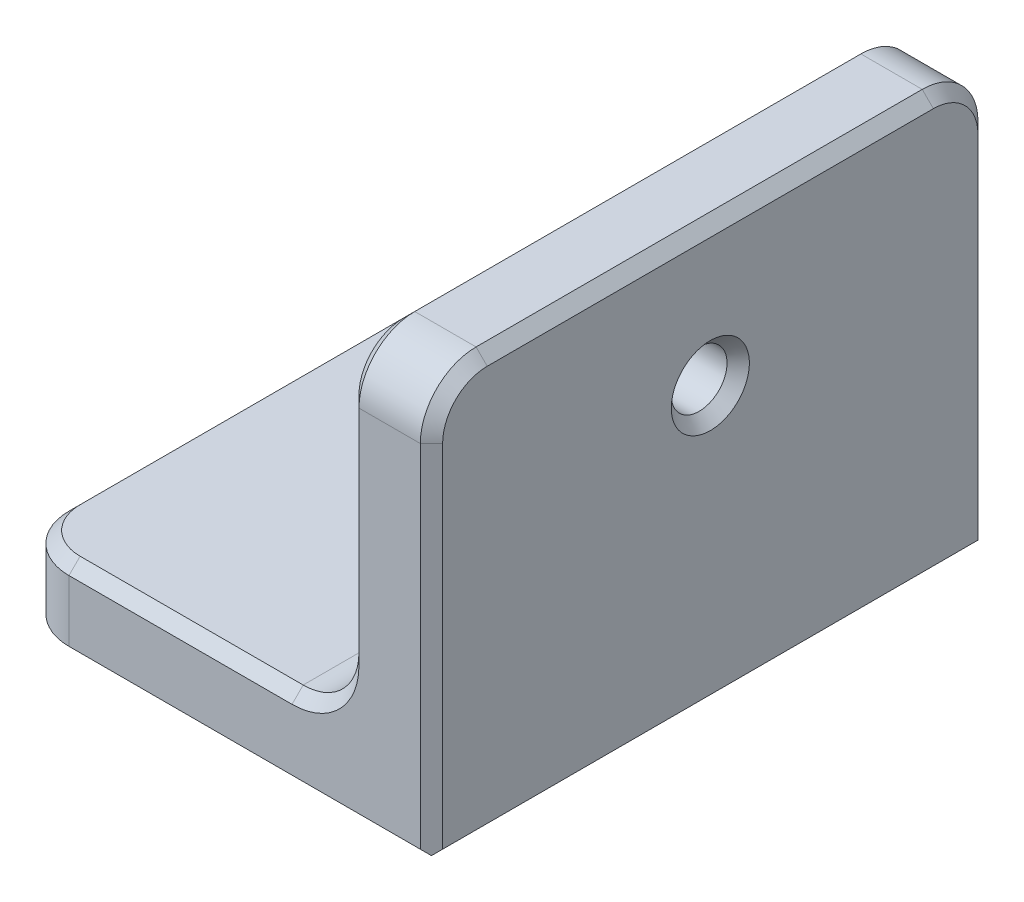
ISO-10303-21;
HEADER;
FILE_DESCRIPTION(('STEP AP214'),'2;1');
FILE_NAME('part.step','',(''),(''),'','','');
FILE_SCHEMA(('AUTOMOTIVE_DESIGN { 1 0 10303 214 1 1 1 1 }'));
ENDSEC;
DATA;
#1=APPLICATION_CONTEXT('core data for automotive mechanical design processes');
#2=APPLICATION_PROTOCOL_DEFINITION('international standard','automotive_design',2000,#1);
#3=PRODUCT_CONTEXT('',#1,'mechanical');
#4=PRODUCT('Part','Part','',(#3));
#5=PRODUCT_RELATED_PRODUCT_CATEGORY('part','',(#4));
#6=PRODUCT_DEFINITION_FORMATION('','',#4);
#7=PRODUCT_DEFINITION_CONTEXT('part definition',#1,'design');
#8=PRODUCT_DEFINITION('design','',#6,#7);
#9=PRODUCT_DEFINITION_SHAPE('','',#8);
#10=(LENGTH_UNIT() NAMED_UNIT(*) SI_UNIT(.MILLI.,.METRE.));
#11=(NAMED_UNIT(*) PLANE_ANGLE_UNIT() SI_UNIT($,.RADIAN.));
#12=(NAMED_UNIT(*) SI_UNIT($,.STERADIAN.) SOLID_ANGLE_UNIT());
#13=UNCERTAINTY_MEASURE_WITH_UNIT(LENGTH_MEASURE(1.E-05),#10,'distance_accuracy_value','');
#14=(GEOMETRIC_REPRESENTATION_CONTEXT(3) GLOBAL_UNCERTAINTY_ASSIGNED_CONTEXT((#13)) GLOBAL_UNIT_ASSIGNED_CONTEXT((#10,
#11,#12)) REPRESENTATION_CONTEXT('',''));
#15=CARTESIAN_POINT('',(0.,0.,0.));
#16=DIRECTION('',(0.,0.,1.));
#17=DIRECTION('',(1.,0.,0.));
#18=AXIS2_PLACEMENT_3D('',#15,#16,#17);
#19=CARTESIAN_POINT('',(0.,3.,0.));
#20=DIRECTION('',(0.,-1.,0.));
#21=DIRECTION('',(0.,0.,-1.));
#22=AXIS2_PLACEMENT_3D('',#19,#20,#21);
#23=PLANE('',#22);
#24=CARTESIAN_POINT('',(5.5,3.,-10.));
#25=DIRECTION('',(0.,1.,0.));
#26=DIRECTION('',(0.,0.,1.));
#27=AXIS2_PLACEMENT_3D('',#24,#25,#26);
#28=CIRCLE('',#27,1.6);
#29=CARTESIAN_POINT('',(5.5,3.,-8.4));
#30=VERTEX_POINT('',#29);
#31=EDGE_CURVE('E261',#30,#30,#28,.T.);
#32=ORIENTED_EDGE('',*,*,#31,.F.);
#33=EDGE_LOOP('',(#32));
#34=FACE_BOUND('',#33,.T.);
#35=CARTESIAN_POINT('',(2.,3.,-2.));
#36=DIRECTION('',(0.,-1.,0.));
#37=DIRECTION('',(0.,0.,-1.));
#38=AXIS2_PLACEMENT_3D('',#35,#36,#37);
#39=CIRCLE('',#38,1.6);
#40=CARTESIAN_POINT('',(0.400000000000001,3.,-2.));
#41=VERTEX_POINT('',#40);
#42=CARTESIAN_POINT('',(2.,3.,-0.400000000000001));
#43=VERTEX_POINT('',#42);
#44=EDGE_CURVE('E330',#41,#43,#39,.F.);
#45=ORIENTED_EDGE('',*,*,#44,.T.);
#46=DIRECTION('',(1.,0.,0.));
#47=VECTOR('',#46,1.);
#48=CARTESIAN_POINT('',(0.,3.,-0.400000000000001));
#49=LINE('',#48,#47);
#50=CARTESIAN_POINT('',(10.,3.,-0.400000000000001));
#51=VERTEX_POINT('',#50);
#52=EDGE_CURVE('E332',#43,#51,#49,.T.);
#53=ORIENTED_EDGE('',*,*,#52,.T.);
#54=DIRECTION('',(0.,0.,1.));
#55=VECTOR('',#54,1.);
#56=CARTESIAN_POINT('',(10.,3.,-20.));
#57=LINE('',#56,#55);
#58=CARTESIAN_POINT('',(10.,3.,-19.6));
#59=VERTEX_POINT('',#58);
#60=EDGE_CURVE('E504',#51,#59,#57,.F.);
#61=ORIENTED_EDGE('',*,*,#60,.T.);
#62=DIRECTION('',(-1.,0.,0.));
#63=VECTOR('',#62,1.);
#64=CARTESIAN_POINT('',(0.,3.,-19.6));
#65=LINE('',#64,#63);
#66=CARTESIAN_POINT('',(2.,3.,-19.6));
#67=VERTEX_POINT('',#66);
#68=EDGE_CURVE('E324',#59,#67,#65,.T.);
#69=ORIENTED_EDGE('',*,*,#68,.T.);
#70=CARTESIAN_POINT('',(2.,3.,-18.));
#71=DIRECTION('',(0.,-1.,0.));
#72=DIRECTION('',(0.,0.,-1.));
#73=AXIS2_PLACEMENT_3D('',#70,#71,#72);
#74=CIRCLE('',#73,1.6);
#75=CARTESIAN_POINT('',(0.400000000000001,3.,-18.));
#76=VERTEX_POINT('',#75);
#77=EDGE_CURVE('E326',#67,#76,#74,.F.);
#78=ORIENTED_EDGE('',*,*,#77,.T.);
#79=DIRECTION('',(0.,0.,1.));
#80=VECTOR('',#79,1.);
#81=CARTESIAN_POINT('',(0.400000000000001,3.,0.));
#82=LINE('',#81,#80);
#83=EDGE_CURVE('E328',#76,#41,#82,.T.);
#84=ORIENTED_EDGE('',*,*,#83,.T.);
#85=EDGE_LOOP('',(#45,#53,#61,#69,#78,#84));
#86=FACE_BOUND('',#85,.T.);
#87=ADVANCED_FACE('F37',(#34,#86),#23,.F.);
#88=CARTESIAN_POINT('',(0.,3.,0.));
#89=DIRECTION('',(1.,0.,0.));
#90=DIRECTION('',(0.,0.,-1.));
#91=AXIS2_PLACEMENT_3D('',#88,#89,#90);
#92=PLANE('',#91);
#93=DIRECTION('',(0.,-1.,0.));
#94=VECTOR('',#93,1.);
#95=CARTESIAN_POINT('',(0.,3.,-2.));
#96=LINE('',#95,#94);
#97=CARTESIAN_POINT('',(0.,0.399999999999998,-2.));
#98=VERTEX_POINT('',#97);
#99=CARTESIAN_POINT('',(0.,2.6,-2.));
#100=VERTEX_POINT('',#99);
#101=EDGE_CURVE('E423',#98,#100,#96,.F.);
#102=ORIENTED_EDGE('',*,*,#101,.T.);
#103=DIRECTION('',(0.,0.,-1.));
#104=VECTOR('',#103,1.);
#105=CARTESIAN_POINT('',(0.,2.6,0.));
#106=LINE('',#105,#104);
#107=CARTESIAN_POINT('',(0.,2.6,-18.));
#108=VERTEX_POINT('',#107);
#109=EDGE_CURVE('E348',#100,#108,#106,.T.);
#110=ORIENTED_EDGE('',*,*,#109,.T.);
#111=DIRECTION('',(0.,-1.,0.));
#112=VECTOR('',#111,1.);
#113=CARTESIAN_POINT('',(0.,3.,-18.));
#114=LINE('',#113,#112);
#115=CARTESIAN_POINT('',(0.,0.399999999999998,-18.));
#116=VERTEX_POINT('',#115);
#117=EDGE_CURVE('E421',#108,#116,#114,.T.);
#118=ORIENTED_EDGE('',*,*,#117,.T.);
#119=DIRECTION('',(0.,0.,1.));
#120=VECTOR('',#119,1.);
#121=CARTESIAN_POINT('',(0.,0.399999999999998,-2.));
#122=LINE('',#121,#120);
#123=EDGE_CURVE('E238',#116,#98,#122,.T.);
#124=ORIENTED_EDGE('',*,*,#123,.T.);
#125=EDGE_LOOP('',(#102,#110,#118,#124));
#126=FACE_BOUND('',#125,.T.);
#127=ADVANCED_FACE('F484',(#126),#92,.F.);
#128=CARTESIAN_POINT('',(0.,3.,0.));
#129=DIRECTION('',(0.,0.,-1.));
#130=DIRECTION('',(-1.,0.,0.));
#131=AXIS2_PLACEMENT_3D('',#128,#129,#130);
#132=PLANE('',#131);
#133=CARTESIAN_POINT('',(10.,5.,0.));
#134=DIRECTION('',(0.,0.,-1.));
#135=DIRECTION('',(-1.,0.,0.));
#136=AXIS2_PLACEMENT_3D('',#133,#134,#135);
#137=CIRCLE('',#136,2.4);
#138=CARTESIAN_POINT('',(12.4,5.,0.));
#139=VERTEX_POINT('',#138);
#140=CARTESIAN_POINT('',(10.,2.6,0.));
#141=VERTEX_POINT('',#140);
#142=EDGE_CURVE('E337',#139,#141,#137,.T.);
#143=ORIENTED_EDGE('',*,*,#142,.T.);
#144=DIRECTION('',(-1.,0.,0.));
#145=VECTOR('',#144,1.);
#146=CARTESIAN_POINT('',(0.,2.6,0.));
#147=LINE('',#146,#145);
#148=CARTESIAN_POINT('',(2.,2.6,0.));
#149=VERTEX_POINT('',#148);
#150=EDGE_CURVE('E339',#141,#149,#147,.T.);
#151=ORIENTED_EDGE('',*,*,#150,.T.);
#152=DIRECTION('',(0.,-1.,0.));
#153=VECTOR('',#152,1.);
#154=CARTESIAN_POINT('',(2.,3.,0.));
#155=LINE('',#154,#153);
#156=CARTESIAN_POINT('',(2.,0.399999999999998,0.));
#157=VERTEX_POINT('',#156);
#158=EDGE_CURVE('E410',#149,#157,#155,.T.);
#159=ORIENTED_EDGE('',*,*,#158,.T.);
#160=DIRECTION('',(1.,0.,0.));
#161=VECTOR('',#160,1.);
#162=CARTESIAN_POINT('',(15.,0.399999999999998,0.));
#163=LINE('',#162,#161);
#164=CARTESIAN_POINT('',(14.6,0.399999999999998,0.));
#165=VERTEX_POINT('',#164);
#166=EDGE_CURVE('E243',#157,#165,#163,.T.);
#167=ORIENTED_EDGE('',*,*,#166,.T.);
#168=DIRECTION('',(0.,1.,0.));
#169=VECTOR('',#168,1.);
#170=CARTESIAN_POINT('',(14.6,3.,0.));
#171=LINE('',#170,#169);
#172=CARTESIAN_POINT('',(14.6,13.,0.));
#173=VERTEX_POINT('',#172);
#174=EDGE_CURVE('E289',#165,#173,#171,.T.);
#175=ORIENTED_EDGE('',*,*,#174,.T.);
#176=DIRECTION('',(1.,0.,0.));
#177=VECTOR('',#176,1.);
#178=CARTESIAN_POINT('',(0.,13.,0.));
#179=LINE('',#178,#177);
#180=CARTESIAN_POINT('',(12.4,13.,0.));
#181=VERTEX_POINT('',#180);
#182=EDGE_CURVE('E413',#173,#181,#179,.F.);
#183=ORIENTED_EDGE('',*,*,#182,.T.);
#184=DIRECTION('',(0.,-1.,0.));
#185=VECTOR('',#184,1.);
#186=CARTESIAN_POINT('',(12.4,3.,0.));
#187=LINE('',#186,#185);
#188=EDGE_CURVE('E335',#181,#139,#187,.T.);
#189=ORIENTED_EDGE('',*,*,#188,.T.);
#190=EDGE_LOOP('',(#143,#151,#159,#167,#175,#183,#189));
#191=FACE_BOUND('',#190,.T.);
#192=ADVANCED_FACE('F469',(#191),#132,.F.);
#193=CARTESIAN_POINT('',(15.,3.,0.));
#194=DIRECTION('',(-1.,0.,0.));
#195=DIRECTION('',(0.,0.,1.));
#196=AXIS2_PLACEMENT_3D('',#193,#194,#195);
#197=PLANE('',#196);
#198=CARTESIAN_POINT('',(15.,10.,-10.));
#199=DIRECTION('',(-1.,0.,0.));
#200=DIRECTION('',(0.,0.,1.));
#201=AXIS2_PLACEMENT_3D('',#198,#199,#200);
#202=CIRCLE('',#201,1.39999999999999);
#203=CARTESIAN_POINT('',(15.,10.,-8.60000000000001));
#204=VERTEX_POINT('',#203);
#205=EDGE_CURVE('E291',#204,#204,#202,.T.);
#206=ORIENTED_EDGE('',*,*,#205,.T.);
#207=EDGE_LOOP('',(#206));
#208=FACE_BOUND('',#207,.T.);
#209=DIRECTION('',(0.,0.,-1.));
#210=VECTOR('',#209,1.);
#211=CARTESIAN_POINT('',(15.,0.399999999999998,-20.));
#212=LINE('',#211,#210);
#213=CARTESIAN_POINT('',(15.,0.399999999999998,-0.399999999999994));
#214=VERTEX_POINT('',#213);
#215=CARTESIAN_POINT('',(15.,0.399999999999998,-19.6));
#216=VERTEX_POINT('',#215);
#217=EDGE_CURVE('E426',#214,#216,#212,.T.);
#218=ORIENTED_EDGE('',*,*,#217,.T.);
#219=DIRECTION('',(0.,1.,0.));
#220=VECTOR('',#219,1.);
#221=CARTESIAN_POINT('',(15.,3.,-19.6));
#222=LINE('',#221,#220);
#223=CARTESIAN_POINT('',(15.,13.,-19.6));
#224=VERTEX_POINT('',#223);
#225=EDGE_CURVE('E277',#216,#224,#222,.T.);
#226=ORIENTED_EDGE('',*,*,#225,.T.);
#227=CARTESIAN_POINT('',(15.,13.,-18.));
#228=DIRECTION('',(-1.,0.,0.));
#229=DIRECTION('',(0.,0.,1.));
#230=AXIS2_PLACEMENT_3D('',#227,#228,#229);
#231=CIRCLE('',#230,1.60000000000001);
#232=CARTESIAN_POINT('',(15.,14.6,-18.));
#233=VERTEX_POINT('',#232);
#234=EDGE_CURVE('E275',#224,#233,#231,.F.);
#235=ORIENTED_EDGE('',*,*,#234,.T.);
#236=DIRECTION('',(0.,0.,1.));
#237=VECTOR('',#236,1.);
#238=CARTESIAN_POINT('',(15.,14.6,0.));
#239=LINE('',#238,#237);
#240=CARTESIAN_POINT('',(15.,14.6,-2.));
#241=VERTEX_POINT('',#240);
#242=EDGE_CURVE('E273',#233,#241,#239,.T.);
#243=ORIENTED_EDGE('',*,*,#242,.T.);
#244=CARTESIAN_POINT('',(15.,13.,-2.));
#245=DIRECTION('',(-1.,0.,0.));
#246=DIRECTION('',(0.,0.,1.));
#247=AXIS2_PLACEMENT_3D('',#244,#245,#246);
#248=CIRCLE('',#247,1.60000000000001);
#249=CARTESIAN_POINT('',(15.,13.,-0.399999999999994));
#250=VERTEX_POINT('',#249);
#251=EDGE_CURVE('E271',#241,#250,#248,.F.);
#252=ORIENTED_EDGE('',*,*,#251,.T.);
#253=DIRECTION('',(0.,-1.,0.));
#254=VECTOR('',#253,1.);
#255=CARTESIAN_POINT('',(15.,3.,-0.399999999999994));
#256=LINE('',#255,#254);
#257=EDGE_CURVE('E269',#250,#214,#256,.T.);
#258=ORIENTED_EDGE('',*,*,#257,.T.);
#259=EDGE_LOOP('',(#218,#226,#235,#243,#252,#258));
#260=FACE_BOUND('',#259,.T.);
#261=ADVANCED_FACE('F450',(#208,#260),#197,.F.);
#262=CARTESIAN_POINT('',(0.,3.,-20.));
#263=DIRECTION('',(0.,0.,1.));
#264=DIRECTION('',(1.,0.,0.));
#265=AXIS2_PLACEMENT_3D('',#262,#263,#264);
#266=PLANE('',#265);
#267=DIRECTION('',(0.,-1.,0.));
#268=VECTOR('',#267,1.);
#269=CARTESIAN_POINT('',(2.,3.,-20.));
#270=LINE('',#269,#268);
#271=CARTESIAN_POINT('',(2.,0.399999999999998,-20.));
#272=VERTEX_POINT('',#271);
#273=CARTESIAN_POINT('',(2.,2.6,-20.));
#274=VERTEX_POINT('',#273);
#275=EDGE_CURVE('E411',#272,#274,#270,.F.);
#276=ORIENTED_EDGE('',*,*,#275,.T.);
#277=DIRECTION('',(1.,0.,0.));
#278=VECTOR('',#277,1.);
#279=CARTESIAN_POINT('',(0.,2.6,-20.));
#280=LINE('',#279,#278);
#281=CARTESIAN_POINT('',(10.,2.6,-20.));
#282=VERTEX_POINT('',#281);
#283=EDGE_CURVE('E47',#274,#282,#280,.T.);
#284=ORIENTED_EDGE('',*,*,#283,.T.);
#285=CARTESIAN_POINT('',(10.,5.,-20.));
#286=DIRECTION('',(0.,0.,1.));
#287=DIRECTION('',(1.,0.,0.));
#288=AXIS2_PLACEMENT_3D('',#285,#286,#287);
#289=CIRCLE('',#288,2.4);
#290=CARTESIAN_POINT('',(12.4,5.,-20.));
#291=VERTEX_POINT('',#290);
#292=EDGE_CURVE('E58',#282,#291,#289,.T.);
#293=ORIENTED_EDGE('',*,*,#292,.T.);
#294=DIRECTION('',(0.,1.,0.));
#295=VECTOR('',#294,1.);
#296=CARTESIAN_POINT('',(12.4,3.,-20.));
#297=LINE('',#296,#295);
#298=CARTESIAN_POINT('',(12.4,13.,-20.));
#299=VERTEX_POINT('',#298);
#300=EDGE_CURVE('E356',#291,#299,#297,.T.);
#301=ORIENTED_EDGE('',*,*,#300,.T.);
#302=DIRECTION('',(-1.,0.,0.));
#303=VECTOR('',#302,1.);
#304=CARTESIAN_POINT('',(0.,13.,-20.));
#305=LINE('',#304,#303);
#306=CARTESIAN_POINT('',(14.6,13.,-20.));
#307=VERTEX_POINT('',#306);
#308=EDGE_CURVE('E403',#299,#307,#305,.F.);
#309=ORIENTED_EDGE('',*,*,#308,.T.);
#310=DIRECTION('',(0.,-1.,0.));
#311=VECTOR('',#310,1.);
#312=CARTESIAN_POINT('',(14.6,3.,-20.));
#313=LINE('',#312,#311);
#314=CARTESIAN_POINT('',(14.6,0.399999999999998,-20.));
#315=VERTEX_POINT('',#314);
#316=EDGE_CURVE('E249',#307,#315,#313,.T.);
#317=ORIENTED_EDGE('',*,*,#316,.T.);
#318=DIRECTION('',(-1.,0.,0.));
#319=VECTOR('',#318,1.);
#320=CARTESIAN_POINT('',(2.,0.399999999999998,-20.));
#321=LINE('',#320,#319);
#322=EDGE_CURVE('E228',#315,#272,#321,.T.);
#323=ORIENTED_EDGE('',*,*,#322,.T.);
#324=EDGE_LOOP('',(#276,#284,#293,#301,#309,#317,#323));
#325=FACE_BOUND('',#324,.T.);
#326=ADVANCED_FACE('F402',(#325),#266,.F.);
#327=CARTESIAN_POINT('',(0.,0.,0.));
#328=DIRECTION('',(0.,-1.,0.));
#329=DIRECTION('',(0.,0.,-1.));
#330=AXIS2_PLACEMENT_3D('',#327,#328,#329);
#331=PLANE('',#330);
#332=DIRECTION('',(1.,0.,0.));
#333=VECTOR('',#332,1.);
#334=CARTESIAN_POINT('',(15.,0.,-19.6));
#335=LINE('',#334,#333);
#336=CARTESIAN_POINT('',(2.,0.,-19.6));
#337=VERTEX_POINT('',#336);
#338=CARTESIAN_POINT('',(14.6,0.,-19.6));
#339=VERTEX_POINT('',#338);
#340=EDGE_CURVE('E227',#337,#339,#335,.T.);
#341=ORIENTED_EDGE('',*,*,#340,.T.);
#342=DIRECTION('',(0.,0.,1.));
#343=VECTOR('',#342,1.);
#344=CARTESIAN_POINT('',(14.6,0.,0.));
#345=LINE('',#344,#343);
#346=CARTESIAN_POINT('',(14.6,0.,-0.400000000000001));
#347=VERTEX_POINT('',#346);
#348=EDGE_CURVE('E203',#339,#347,#345,.T.);
#349=ORIENTED_EDGE('',*,*,#348,.T.);
#350=DIRECTION('',(-1.,0.,0.));
#351=VECTOR('',#350,1.);
#352=CARTESIAN_POINT('',(2.,0.,-0.400000000000001));
#353=LINE('',#352,#351);
#354=CARTESIAN_POINT('',(2.,0.,-0.400000000000001));
#355=VERTEX_POINT('',#354);
#356=EDGE_CURVE('E214',#347,#355,#353,.T.);
#357=ORIENTED_EDGE('',*,*,#356,.T.);
#358=CARTESIAN_POINT('',(2.,0.,-2.));
#359=DIRECTION('',(0.,-1.,0.));
#360=DIRECTION('',(0.,0.,-1.));
#361=AXIS2_PLACEMENT_3D('',#358,#359,#360);
#362=CIRCLE('',#361,1.6);
#363=CARTESIAN_POINT('',(0.400000000000001,0.,-2.));
#364=VERTEX_POINT('',#363);
#365=EDGE_CURVE('E221',#355,#364,#362,.T.);
#366=ORIENTED_EDGE('',*,*,#365,.T.);
#367=DIRECTION('',(0.,0.,-1.));
#368=VECTOR('',#367,1.);
#369=CARTESIAN_POINT('',(0.400000000000001,0.,-18.));
#370=LINE('',#369,#368);
#371=CARTESIAN_POINT('',(0.400000000000001,0.,-18.));
#372=VERTEX_POINT('',#371);
#373=EDGE_CURVE('E432',#364,#372,#370,.T.);
#374=ORIENTED_EDGE('',*,*,#373,.T.);
#375=CARTESIAN_POINT('',(2.,0.,-18.));
#376=DIRECTION('',(0.,-1.,0.));
#377=DIRECTION('',(0.,0.,-1.));
#378=AXIS2_PLACEMENT_3D('',#375,#376,#377);
#379=CIRCLE('',#378,1.6);
#380=EDGE_CURVE('E232',#372,#337,#379,.T.);
#381=ORIENTED_EDGE('',*,*,#380,.T.);
#382=EDGE_LOOP('',(#341,#349,#357,#366,#374,#381));
#383=FACE_BOUND('',#382,.T.);
#384=CARTESIAN_POINT('',(5.5,0.,-10.));
#385=DIRECTION('',(0.,-1.,0.));
#386=DIRECTION('',(0.,0.,-1.));
#387=AXIS2_PLACEMENT_3D('',#384,#385,#386);
#388=CIRCLE('',#387,2.);
#389=CARTESIAN_POINT('',(5.5,0.,-12.));
#390=VERTEX_POINT('',#389);
#391=EDGE_CURVE('E222',#390,#390,#388,.F.);
#392=ORIENTED_EDGE('',*,*,#391,.T.);
#393=EDGE_LOOP('',(#392));
#394=FACE_BOUND('',#393,.T.);
#395=ADVANCED_FACE('F224',(#383,#394),#331,.T.);
#396=CARTESIAN_POINT('',(5.5,0.,-10.));
#397=DIRECTION('',(0.,1.,0.));
#398=DIRECTION('',(0.,0.,1.));
#399=AXIS2_PLACEMENT_3D('',#396,#397,#398);
#400=CYLINDRICAL_SURFACE('',#399,1.6);
#401=CARTESIAN_POINT('',(5.5,0.400000000000007,-10.));
#402=DIRECTION('',(0.,-1.,0.));
#403=DIRECTION('',(0.,0.,-1.));
#404=AXIS2_PLACEMENT_3D('',#401,#402,#403);
#405=CIRCLE('',#404,1.6);
#406=CARTESIAN_POINT('',(5.5,0.400000000000007,-11.6));
#407=VERTEX_POINT('',#406);
#408=EDGE_CURVE('E246',#407,#407,#405,.T.);
#409=ORIENTED_EDGE('',*,*,#408,.T.);
#410=EDGE_LOOP('',(#409));
#411=FACE_BOUND('',#410,.T.);
#412=ORIENTED_EDGE('',*,*,#31,.T.);
#413=EDGE_LOOP('',(#412));
#414=FACE_BOUND('',#413,.T.);
#415=ADVANCED_FACE('F570',(#411,#414),#400,.F.);
#416=CARTESIAN_POINT('',(12.,15.,-20.));
#417=DIRECTION('',(1.,0.,0.));
#418=DIRECTION('',(0.,0.,-1.));
#419=AXIS2_PLACEMENT_3D('',#416,#417,#418);
#420=PLANE('',#419);
#421=CARTESIAN_POINT('',(12.,10.,-10.));
#422=DIRECTION('',(1.,0.,0.));
#423=DIRECTION('',(0.,0.,-1.));
#424=AXIS2_PLACEMENT_3D('',#421,#422,#423);
#425=CIRCLE('',#424,1.4);
#426=CARTESIAN_POINT('',(12.,10.,-11.4));
#427=VERTEX_POINT('',#426);
#428=EDGE_CURVE('E321',#427,#427,#425,.T.);
#429=ORIENTED_EDGE('',*,*,#428,.T.);
#430=EDGE_LOOP('',(#429));
#431=FACE_BOUND('',#430,.T.);
#432=DIRECTION('',(0.,0.,1.));
#433=VECTOR('',#432,1.);
#434=CARTESIAN_POINT('',(12.,5.,0.));
#435=LINE('',#434,#433);
#436=CARTESIAN_POINT('',(12.,5.,-19.6));
#437=VERTEX_POINT('',#436);
#438=CARTESIAN_POINT('',(12.,5.,-0.400000000000001));
#439=VERTEX_POINT('',#438);
#440=EDGE_CURVE('E508',#437,#439,#435,.T.);
#441=ORIENTED_EDGE('',*,*,#440,.T.);
#442=DIRECTION('',(0.,1.,0.));
#443=VECTOR('',#442,1.);
#444=CARTESIAN_POINT('',(12.,15.,-0.400000000000001));
#445=LINE('',#444,#443);
#446=CARTESIAN_POINT('',(12.,13.,-0.400000000000001));
#447=VERTEX_POINT('',#446);
#448=EDGE_CURVE('E319',#439,#447,#445,.T.);
#449=ORIENTED_EDGE('',*,*,#448,.T.);
#450=CARTESIAN_POINT('',(12.,13.,-2.));
#451=DIRECTION('',(1.,0.,0.));
#452=DIRECTION('',(0.,0.,-1.));
#453=AXIS2_PLACEMENT_3D('',#450,#451,#452);
#454=CIRCLE('',#453,1.6);
#455=CARTESIAN_POINT('',(12.,14.6,-2.));
#456=VERTEX_POINT('',#455);
#457=EDGE_CURVE('E317',#447,#456,#454,.F.);
#458=ORIENTED_EDGE('',*,*,#457,.T.);
#459=DIRECTION('',(0.,0.,-1.));
#460=VECTOR('',#459,1.);
#461=CARTESIAN_POINT('',(12.,14.6,-20.));
#462=LINE('',#461,#460);
#463=CARTESIAN_POINT('',(12.,14.6,-18.));
#464=VERTEX_POINT('',#463);
#465=EDGE_CURVE('E315',#456,#464,#462,.T.);
#466=ORIENTED_EDGE('',*,*,#465,.T.);
#467=CARTESIAN_POINT('',(12.,13.,-18.));
#468=DIRECTION('',(1.,0.,0.));
#469=DIRECTION('',(0.,0.,-1.));
#470=AXIS2_PLACEMENT_3D('',#467,#468,#469);
#471=CIRCLE('',#470,1.6);
#472=CARTESIAN_POINT('',(12.,13.,-19.6));
#473=VERTEX_POINT('',#472);
#474=EDGE_CURVE('E313',#464,#473,#471,.F.);
#475=ORIENTED_EDGE('',*,*,#474,.T.);
#476=DIRECTION('',(0.,-1.,0.));
#477=VECTOR('',#476,1.);
#478=CARTESIAN_POINT('',(12.,15.,-19.6));
#479=LINE('',#478,#477);
#480=EDGE_CURVE('E311',#473,#437,#479,.T.);
#481=ORIENTED_EDGE('',*,*,#480,.T.);
#482=EDGE_LOOP('',(#441,#449,#458,#466,#475,#481));
#483=FACE_BOUND('',#482,.T.);
#484=ADVANCED_FACE('F827',(#431,#483),#420,.F.);
#485=CARTESIAN_POINT('',(0.,15.,0.));
#486=DIRECTION('',(0.,-1.,0.));
#487=DIRECTION('',(0.,0.,-1.));
#488=AXIS2_PLACEMENT_3D('',#485,#486,#487);
#489=PLANE('',#488);
#490=DIRECTION('',(-1.,0.,0.));
#491=VECTOR('',#490,1.);
#492=CARTESIAN_POINT('',(0.,15.,-18.));
#493=LINE('',#492,#491);
#494=CARTESIAN_POINT('',(14.6,15.,-18.));
#495=VERTEX_POINT('',#494);
#496=CARTESIAN_POINT('',(12.4,15.,-18.));
#497=VERTEX_POINT('',#496);
#498=EDGE_CURVE('E415',#495,#497,#493,.T.);
#499=ORIENTED_EDGE('',*,*,#498,.T.);
#500=DIRECTION('',(0.,0.,1.));
#501=VECTOR('',#500,1.);
#502=CARTESIAN_POINT('',(12.4,15.,0.));
#503=LINE('',#502,#501);
#504=CARTESIAN_POINT('',(12.4,15.,-2.));
#505=VERTEX_POINT('',#504);
#506=EDGE_CURVE('E354',#497,#505,#503,.T.);
#507=ORIENTED_EDGE('',*,*,#506,.T.);
#508=DIRECTION('',(1.,0.,0.));
#509=VECTOR('',#508,1.);
#510=CARTESIAN_POINT('',(0.,15.,-2.));
#511=LINE('',#510,#509);
#512=CARTESIAN_POINT('',(14.6,15.,-2.));
#513=VERTEX_POINT('',#512);
#514=EDGE_CURVE('E507',#505,#513,#511,.T.);
#515=ORIENTED_EDGE('',*,*,#514,.T.);
#516=DIRECTION('',(0.,0.,-1.));
#517=VECTOR('',#516,1.);
#518=CARTESIAN_POINT('',(14.6,15.,0.));
#519=LINE('',#518,#517);
#520=EDGE_CURVE('E282',#513,#495,#519,.T.);
#521=ORIENTED_EDGE('',*,*,#520,.T.);
#522=EDGE_LOOP('',(#499,#507,#515,#521));
#523=FACE_BOUND('',#522,.T.);
#524=ADVANCED_FACE('F516',(#523),#489,.F.);
#525=CARTESIAN_POINT('',(10.,5.,-20.));
#526=DIRECTION('',(0.,0.,-1.));
#527=DIRECTION('',(-1.,0.,0.));
#528=AXIS2_PLACEMENT_3D('',#525,#526,#527);
#529=CYLINDRICAL_SURFACE('',#528,2.);
#530=ORIENTED_EDGE('',*,*,#60,.F.);
#531=CARTESIAN_POINT('',(10.,5.,-0.400000000000001));
#532=DIRECTION('',(0.,0.,-1.));
#533=DIRECTION('',(-1.,0.,0.));
#534=AXIS2_PLACEMENT_3D('',#531,#532,#533);
#535=CIRCLE('',#534,2.);
#536=EDGE_CURVE('E344',#51,#439,#535,.F.);
#537=ORIENTED_EDGE('',*,*,#536,.T.);
#538=ORIENTED_EDGE('',*,*,#440,.F.);
#539=CARTESIAN_POINT('',(10.,5.,-19.6));
#540=DIRECTION('',(0.,0.,1.));
#541=DIRECTION('',(1.,0.,0.));
#542=AXIS2_PLACEMENT_3D('',#539,#540,#541);
#543=CIRCLE('',#542,2.);
#544=EDGE_CURVE('E342',#437,#59,#543,.F.);
#545=ORIENTED_EDGE('',*,*,#544,.T.);
#546=EDGE_LOOP('',(#530,#537,#538,#545));
#547=FACE_BOUND('',#546,.T.);
#548=ADVANCED_FACE('F581',(#547),#529,.F.);
#549=CARTESIAN_POINT('',(22.,10.,-10.));
#550=DIRECTION('',(-1.,0.,0.));
#551=DIRECTION('',(0.,0.,1.));
#552=AXIS2_PLACEMENT_3D('',#549,#550,#551);
#553=CYLINDRICAL_SURFACE('',#552,0.999999999999999);
#554=CARTESIAN_POINT('',(14.6,10.,-10.));
#555=DIRECTION('',(-1.,0.,0.));
#556=DIRECTION('',(0.,0.,1.));
#557=AXIS2_PLACEMENT_3D('',#554,#555,#556);
#558=CIRCLE('',#557,0.999999999999999);
#559=CARTESIAN_POINT('',(14.6,10.,-9.));
#560=VERTEX_POINT('',#559);
#561=EDGE_CURVE('E308',#560,#560,#558,.F.);
#562=ORIENTED_EDGE('',*,*,#561,.T.);
#563=EDGE_LOOP('',(#562));
#564=FACE_BOUND('',#563,.T.);
#565=CARTESIAN_POINT('',(12.4,10.,-10.));
#566=DIRECTION('',(1.,0.,0.));
#567=DIRECTION('',(0.,0.,-1.));
#568=AXIS2_PLACEMENT_3D('',#565,#566,#567);
#569=CIRCLE('',#568,0.999999999999999);
#570=CARTESIAN_POINT('',(12.4,10.,-11.));
#571=VERTEX_POINT('',#570);
#572=EDGE_CURVE('E305',#571,#571,#569,.F.);
#573=ORIENTED_EDGE('',*,*,#572,.T.);
#574=EDGE_LOOP('',(#573));
#575=FACE_BOUND('',#574,.T.);
#576=ADVANCED_FACE('F584',(#564,#575),#553,.F.);
#577=CARTESIAN_POINT('',(0.,13.,-18.));
#578=DIRECTION('',(-1.,0.,0.));
#579=DIRECTION('',(0.,0.,1.));
#580=AXIS2_PLACEMENT_3D('',#577,#578,#579);
#581=CYLINDRICAL_SURFACE('',#580,2.);
#582=ORIENTED_EDGE('',*,*,#308,.F.);
#583=CARTESIAN_POINT('',(12.4,13.,-18.));
#584=DIRECTION('',(1.,0.,0.));
#585=DIRECTION('',(0.,0.,-1.));
#586=AXIS2_PLACEMENT_3D('',#583,#584,#585);
#587=CIRCLE('',#586,2.);
#588=EDGE_CURVE('E11',#299,#497,#587,.T.);
#589=ORIENTED_EDGE('',*,*,#588,.T.);
#590=ORIENTED_EDGE('',*,*,#498,.F.);
#591=CARTESIAN_POINT('',(14.6,13.,-18.));
#592=DIRECTION('',(-1.,0.,0.));
#593=DIRECTION('',(0.,0.,1.));
#594=AXIS2_PLACEMENT_3D('',#591,#592,#593);
#595=CIRCLE('',#594,2.);
#596=EDGE_CURVE('E279',#495,#307,#595,.T.);
#597=ORIENTED_EDGE('',*,*,#596,.T.);
#598=EDGE_LOOP('',(#582,#589,#590,#597));
#599=FACE_BOUND('',#598,.T.);
#600=ADVANCED_FACE('F405',(#599),#581,.T.);
#601=CARTESIAN_POINT('',(0.,13.,-2.));
#602=DIRECTION('',(1.,0.,0.));
#603=DIRECTION('',(0.,0.,-1.));
#604=AXIS2_PLACEMENT_3D('',#601,#602,#603);
#605=CYLINDRICAL_SURFACE('',#604,2.);
#606=ORIENTED_EDGE('',*,*,#514,.F.);
#607=CARTESIAN_POINT('',(12.4,13.,-2.));
#608=DIRECTION('',(1.,0.,0.));
#609=DIRECTION('',(0.,0.,-1.));
#610=AXIS2_PLACEMENT_3D('',#607,#608,#609);
#611=CIRCLE('',#610,2.);
#612=EDGE_CURVE('E350',#505,#181,#611,.T.);
#613=ORIENTED_EDGE('',*,*,#612,.T.);
#614=ORIENTED_EDGE('',*,*,#182,.F.);
#615=CARTESIAN_POINT('',(14.6,13.,-2.));
#616=DIRECTION('',(-1.,0.,0.));
#617=DIRECTION('',(0.,0.,1.));
#618=AXIS2_PLACEMENT_3D('',#615,#616,#617);
#619=CIRCLE('',#618,2.);
#620=EDGE_CURVE('E284',#173,#513,#619,.T.);
#621=ORIENTED_EDGE('',*,*,#620,.T.);
#622=EDGE_LOOP('',(#606,#613,#614,#621));
#623=FACE_BOUND('',#622,.T.);
#624=ADVANCED_FACE('F531',(#623),#605,.T.);
#625=CARTESIAN_POINT('',(2.,3.,-2.));
#626=DIRECTION('',(0.,-1.,0.));
#627=DIRECTION('',(0.,0.,-1.));
#628=AXIS2_PLACEMENT_3D('',#625,#626,#627);
#629=CYLINDRICAL_SURFACE('',#628,2.);
#630=ORIENTED_EDGE('',*,*,#158,.F.);
#631=CARTESIAN_POINT('',(2.,2.6,-2.));
#632=DIRECTION('',(0.,-1.,0.));
#633=DIRECTION('',(0.,0.,-1.));
#634=AXIS2_PLACEMENT_3D('',#631,#632,#633);
#635=CIRCLE('',#634,2.);
#636=EDGE_CURVE('E346',#149,#100,#635,.T.);
#637=ORIENTED_EDGE('',*,*,#636,.T.);
#638=ORIENTED_EDGE('',*,*,#101,.F.);
#639=CARTESIAN_POINT('',(2.,0.399999999999998,-2.));
#640=DIRECTION('',(0.,-1.,0.));
#641=DIRECTION('',(0.,0.,-1.));
#642=AXIS2_PLACEMENT_3D('',#639,#640,#641);
#643=CIRCLE('',#642,2.);
#644=EDGE_CURVE('E240',#98,#157,#643,.F.);
#645=ORIENTED_EDGE('',*,*,#644,.T.);
#646=EDGE_LOOP('',(#630,#637,#638,#645));
#647=FACE_BOUND('',#646,.T.);
#648=ADVANCED_FACE('F476',(#647),#629,.T.);
#649=CARTESIAN_POINT('',(2.,3.,-18.));
#650=DIRECTION('',(0.,-1.,0.));
#651=DIRECTION('',(0.,0.,-1.));
#652=AXIS2_PLACEMENT_3D('',#649,#650,#651);
#653=CYLINDRICAL_SURFACE('',#652,2.);
#654=ORIENTED_EDGE('',*,*,#117,.F.);
#655=CARTESIAN_POINT('',(2.,2.6,-18.));
#656=DIRECTION('',(0.,-1.,0.));
#657=DIRECTION('',(0.,0.,-1.));
#658=AXIS2_PLACEMENT_3D('',#655,#656,#657);
#659=CIRCLE('',#658,2.);
#660=EDGE_CURVE('E352',#108,#274,#659,.T.);
#661=ORIENTED_EDGE('',*,*,#660,.T.);
#662=ORIENTED_EDGE('',*,*,#275,.F.);
#663=CARTESIAN_POINT('',(2.,0.399999999999998,-18.));
#664=DIRECTION('',(0.,-1.,0.));
#665=DIRECTION('',(0.,0.,-1.));
#666=AXIS2_PLACEMENT_3D('',#663,#664,#665);
#667=CIRCLE('',#666,2.);
#668=EDGE_CURVE('E230',#272,#116,#667,.F.);
#669=ORIENTED_EDGE('',*,*,#668,.T.);
#670=EDGE_LOOP('',(#654,#661,#662,#669));
#671=FACE_BOUND('',#670,.T.);
#672=ADVANCED_FACE('F490',(#671),#653,.T.);
#673=CARTESIAN_POINT('',(0.,0.399999999999998,0.));
#674=DIRECTION('',(-0.707106781186544,-0.707106781186551,0.));
#675=DIRECTION('',(0.,0.,-1.));
#676=AXIS2_PLACEMENT_3D('',#673,#674,#675);
#677=PLANE('',#676);
#678=DIRECTION('',(-0.707106781186551,0.707106781186544,0.));
#679=VECTOR('',#678,1.);
#680=CARTESIAN_POINT('',(0.400000000000001,0.,-18.));
#681=LINE('',#680,#679);
#682=EDGE_CURVE('E255',#372,#116,#681,.T.);
#683=ORIENTED_EDGE('',*,*,#682,.F.);
#684=ORIENTED_EDGE('',*,*,#373,.F.);
#685=DIRECTION('',(0.707106781186551,-0.707106781186544,0.));
#686=VECTOR('',#685,1.);
#687=CARTESIAN_POINT('',(0.,0.399999999999998,-2.));
#688=LINE('',#687,#686);
#689=EDGE_CURVE('E258',#98,#364,#688,.T.);
#690=ORIENTED_EDGE('',*,*,#689,.F.);
#691=ORIENTED_EDGE('',*,*,#123,.F.);
#692=EDGE_LOOP('',(#683,#684,#690,#691));
#693=FACE_BOUND('',#692,.T.);
#694=ADVANCED_FACE('F481',(#693),#677,.T.);
#695=CARTESIAN_POINT('',(2.,0.,-2.));
#696=DIRECTION('',(0.,1.,0.));
#697=DIRECTION('',(0.,0.,1.));
#698=AXIS2_PLACEMENT_3D('',#695,#696,#697);
#699=CONICAL_SURFACE('',#698,1.6,0.785398163397453);
#700=ORIENTED_EDGE('',*,*,#689,.T.);
#701=ORIENTED_EDGE('',*,*,#365,.F.);
#702=DIRECTION('',(0.,-0.707106781186544,-0.707106781186551));
#703=VECTOR('',#702,1.);
#704=CARTESIAN_POINT('',(2.,0.399999999999998,0.));
#705=LINE('',#704,#703);
#706=EDGE_CURVE('E218',#157,#355,#705,.T.);
#707=ORIENTED_EDGE('',*,*,#706,.F.);
#708=ORIENTED_EDGE('',*,*,#644,.F.);
#709=EDGE_LOOP('',(#700,#701,#707,#708));
#710=FACE_BOUND('',#709,.T.);
#711=ADVANCED_FACE('F479',(#710),#699,.T.);
#712=CARTESIAN_POINT('',(2.,0.,-18.));
#713=DIRECTION('',(0.,1.,0.));
#714=DIRECTION('',(0.,0.,1.));
#715=AXIS2_PLACEMENT_3D('',#712,#713,#714);
#716=CONICAL_SURFACE('',#715,1.6,0.785398163397453);
#717=ORIENTED_EDGE('',*,*,#682,.T.);
#718=ORIENTED_EDGE('',*,*,#668,.F.);
#719=DIRECTION('',(0.,0.707106781186544,-0.707106781186551));
#720=VECTOR('',#719,1.);
#721=CARTESIAN_POINT('',(2.,0.,-19.6));
#722=LINE('',#721,#720);
#723=EDGE_CURVE('E210',#337,#272,#722,.T.);
#724=ORIENTED_EDGE('',*,*,#723,.F.);
#725=ORIENTED_EDGE('',*,*,#380,.F.);
#726=EDGE_LOOP('',(#717,#718,#724,#725));
#727=FACE_BOUND('',#726,.T.);
#728=ADVANCED_FACE('F439',(#727),#716,.T.);
#729=CARTESIAN_POINT('',(0.,0.399999999999998,0.));
#730=DIRECTION('',(0.,-0.707106781186551,0.707106781186544));
#731=DIRECTION('',(-1.,0.,0.));
#732=AXIS2_PLACEMENT_3D('',#729,#730,#731);
#733=PLANE('',#732);
#734=DIRECTION('',(0.577350269189627,0.577350269189622,0.577350269189627));
#735=VECTOR('',#734,1.);
#736=CARTESIAN_POINT('',(9.99999999999997,-4.59999999999999,-5.00000000000003));
#737=LINE('',#736,#735);
#738=CARTESIAN_POINT('',(14.8,0.200000000000001,-0.199999999999999));
#739=VERTEX_POINT('',#738);
#740=EDGE_CURVE('E198',#739,#347,#737,.F.);
#741=ORIENTED_EDGE('',*,*,#740,.F.);
#742=DIRECTION('',(0.577350269189631,-0.577350269189621,-0.577350269189626));
#743=VECTOR('',#742,1.);
#744=CARTESIAN_POINT('',(9.73333333333325,5.26666666666666,4.86666666666671));
#745=LINE('',#744,#743);
#746=EDGE_CURVE('E287',#739,#165,#745,.F.);
#747=ORIENTED_EDGE('',*,*,#746,.T.);
#748=ORIENTED_EDGE('',*,*,#166,.F.);
#749=ORIENTED_EDGE('',*,*,#706,.T.);
#750=ORIENTED_EDGE('',*,*,#356,.F.);
#751=EDGE_LOOP('',(#741,#747,#748,#749,#750));
#752=FACE_BOUND('',#751,.T.);
#753=ADVANCED_FACE('F215',(#752),#733,.T.);
#754=CARTESIAN_POINT('',(0.,0.399999999999998,-20.));
#755=DIRECTION('',(0.,-0.707106781186551,-0.707106781186544));
#756=DIRECTION('',(1.,0.,0.));
#757=AXIS2_PLACEMENT_3D('',#754,#755,#756);
#758=PLANE('',#757);
#759=ORIENTED_EDGE('',*,*,#322,.F.);
#760=DIRECTION('',(-0.577350269189631,0.577350269189621,-0.577350269189626));
#761=VECTOR('',#760,1.);
#762=CARTESIAN_POINT('',(9.73333333333325,5.26666666666666,-24.8666666666667));
#763=LINE('',#762,#761);
#764=CARTESIAN_POINT('',(14.8,0.200000000000002,-19.8));
#765=VERTEX_POINT('',#764);
#766=EDGE_CURVE('E264',#315,#765,#763,.F.);
#767=ORIENTED_EDGE('',*,*,#766,.T.);
#768=DIRECTION('',(-0.577350269189627,-0.577350269189622,0.577350269189627));
#769=VECTOR('',#768,1.);
#770=CARTESIAN_POINT('',(9.99999999999997,-4.59999999999999,-15.));
#771=LINE('',#770,#769);
#772=EDGE_CURVE('E211',#339,#765,#771,.F.);
#773=ORIENTED_EDGE('',*,*,#772,.F.);
#774=ORIENTED_EDGE('',*,*,#340,.F.);
#775=ORIENTED_EDGE('',*,*,#723,.T.);
#776=EDGE_LOOP('',(#759,#767,#773,#774,#775));
#777=FACE_BOUND('',#776,.T.);
#778=ADVANCED_FACE('F442',(#777),#758,.T.);
#779=CARTESIAN_POINT('',(15.,0.399999999999998,0.));
#780=DIRECTION('',(0.707106781186544,-0.707106781186551,0.));
#781=DIRECTION('',(0.,0.,1.));
#782=AXIS2_PLACEMENT_3D('',#779,#780,#781);
#783=PLANE('',#782);
#784=ORIENTED_EDGE('',*,*,#772,.T.);
#785=DIRECTION('',(-0.577350269189629,-0.577350269189624,-0.577350269189624));
#786=VECTOR('',#785,1.);
#787=CARTESIAN_POINT('',(21.5333333333334,6.9333333333333,-13.0666666666667));
#788=LINE('',#787,#786);
#789=EDGE_CURVE('E267',#765,#216,#788,.F.);
#790=ORIENTED_EDGE('',*,*,#789,.T.);
#791=ORIENTED_EDGE('',*,*,#217,.F.);
#792=DIRECTION('',(0.577350269189629,0.577350269189624,-0.577350269189624));
#793=VECTOR('',#792,1.);
#794=CARTESIAN_POINT('',(14.8666666666667,0.266666666666667,-0.266666666666664));
#795=LINE('',#794,#793);
#796=EDGE_CURVE('E207',#214,#739,#795,.F.);
#797=ORIENTED_EDGE('',*,*,#796,.T.);
#798=ORIENTED_EDGE('',*,*,#740,.T.);
#799=ORIENTED_EDGE('',*,*,#348,.F.);
#800=EDGE_LOOP('',(#784,#790,#791,#797,#798,#799));
#801=FACE_BOUND('',#800,.T.);
#802=ADVANCED_FACE('F201',(#801),#783,.T.);
#803=CARTESIAN_POINT('',(5.5,0.,-10.));
#804=DIRECTION('',(0.,-1.,0.));
#805=DIRECTION('',(0.,0.,-1.));
#806=AXIS2_PLACEMENT_3D('',#803,#804,#805);
#807=CONICAL_SURFACE('',#806,2.,0.785398163397444);
#808=ORIENTED_EDGE('',*,*,#408,.F.);
#809=EDGE_LOOP('',(#808));
#810=FACE_BOUND('',#809,.T.);
#811=ORIENTED_EDGE('',*,*,#391,.F.);
#812=EDGE_LOOP('',(#811));
#813=FACE_BOUND('',#812,.T.);
#814=ADVANCED_FACE('F600',(#810,#813),#807,.F.);
#815=CARTESIAN_POINT('',(15.,3.,-0.399999999999994));
#816=DIRECTION('',(-0.707106781186544,0.,-0.707106781186551));
#817=DIRECTION('',(0.,-1.,0.));
#818=AXIS2_PLACEMENT_3D('',#815,#816,#817);
#819=PLANE('',#818);
#820=ORIENTED_EDGE('',*,*,#796,.F.);
#821=ORIENTED_EDGE('',*,*,#257,.F.);
#822=DIRECTION('',(0.707106781186551,0.,-0.707106781186544));
#823=VECTOR('',#822,1.);
#824=CARTESIAN_POINT('',(14.6,13.,0.));
#825=LINE('',#824,#823);
#826=EDGE_CURVE('E250',#173,#250,#825,.T.);
#827=ORIENTED_EDGE('',*,*,#826,.F.);
#828=ORIENTED_EDGE('',*,*,#174,.F.);
#829=ORIENTED_EDGE('',*,*,#746,.F.);
#830=EDGE_LOOP('',(#820,#821,#827,#828,#829));
#831=FACE_BOUND('',#830,.T.);
#832=ADVANCED_FACE('F467',(#831),#819,.F.);
#833=CARTESIAN_POINT('',(15.,13.,-2.));
#834=DIRECTION('',(-1.,0.,0.));
#835=DIRECTION('',(0.,0.,1.));
#836=AXIS2_PLACEMENT_3D('',#833,#834,#835);
#837=CONICAL_SURFACE('',#836,1.60000000000001,0.785398163397444);
#838=ORIENTED_EDGE('',*,*,#826,.T.);
#839=ORIENTED_EDGE('',*,*,#251,.F.);
#840=DIRECTION('',(0.707106781186551,-0.707106781186544,0.));
#841=VECTOR('',#840,1.);
#842=CARTESIAN_POINT('',(14.6,15.,-2.));
#843=LINE('',#842,#841);
#844=EDGE_CURVE('E298',#513,#241,#843,.T.);
#845=ORIENTED_EDGE('',*,*,#844,.F.);
#846=ORIENTED_EDGE('',*,*,#620,.F.);
#847=EDGE_LOOP('',(#838,#839,#845,#846));
#848=FACE_BOUND('',#847,.T.);
#849=ADVANCED_FACE('F462',(#848),#837,.T.);
#850=CARTESIAN_POINT('',(14.6,15.,0.));
#851=DIRECTION('',(-0.707106781186544,-0.707106781186551,0.));
#852=DIRECTION('',(0.,0.,-1.));
#853=AXIS2_PLACEMENT_3D('',#850,#851,#852);
#854=PLANE('',#853);
#855=ORIENTED_EDGE('',*,*,#844,.T.);
#856=ORIENTED_EDGE('',*,*,#242,.F.);
#857=DIRECTION('',(0.707106781186551,-0.707106781186544,0.));
#858=VECTOR('',#857,1.);
#859=CARTESIAN_POINT('',(14.6,15.,-18.));
#860=LINE('',#859,#858);
#861=EDGE_CURVE('E295',#495,#233,#860,.T.);
#862=ORIENTED_EDGE('',*,*,#861,.F.);
#863=ORIENTED_EDGE('',*,*,#520,.F.);
#864=EDGE_LOOP('',(#855,#856,#862,#863));
#865=FACE_BOUND('',#864,.T.);
#866=ADVANCED_FACE('F457',(#865),#854,.F.);
#867=CARTESIAN_POINT('',(15.,13.,-18.));
#868=DIRECTION('',(-1.,0.,0.));
#869=DIRECTION('',(0.,0.,1.));
#870=AXIS2_PLACEMENT_3D('',#867,#868,#869);
#871=CONICAL_SURFACE('',#870,1.60000000000001,0.785398163397444);
#872=ORIENTED_EDGE('',*,*,#861,.T.);
#873=ORIENTED_EDGE('',*,*,#234,.F.);
#874=DIRECTION('',(0.707106781186551,0.,0.707106781186544));
#875=VECTOR('',#874,1.);
#876=CARTESIAN_POINT('',(14.6,13.,-20.));
#877=LINE('',#876,#875);
#878=EDGE_CURVE('E292',#307,#224,#877,.T.);
#879=ORIENTED_EDGE('',*,*,#878,.F.);
#880=ORIENTED_EDGE('',*,*,#596,.F.);
#881=EDGE_LOOP('',(#872,#873,#879,#880));
#882=FACE_BOUND('',#881,.T.);
#883=ADVANCED_FACE('F453',(#882),#871,.T.);
#884=CARTESIAN_POINT('',(14.6,3.,-20.));
#885=DIRECTION('',(-0.707106781186544,0.,0.707106781186551));
#886=DIRECTION('',(0.,-1.,0.));
#887=AXIS2_PLACEMENT_3D('',#884,#885,#886);
#888=PLANE('',#887);
#889=ORIENTED_EDGE('',*,*,#878,.T.);
#890=ORIENTED_EDGE('',*,*,#225,.F.);
#891=ORIENTED_EDGE('',*,*,#789,.F.);
#892=ORIENTED_EDGE('',*,*,#766,.F.);
#893=ORIENTED_EDGE('',*,*,#316,.F.);
#894=EDGE_LOOP('',(#889,#890,#891,#892,#893));
#895=FACE_BOUND('',#894,.T.);
#896=ADVANCED_FACE('F446',(#895),#888,.F.);
#897=CARTESIAN_POINT('',(15.,10.,-10.));
#898=DIRECTION('',(1.,0.,0.));
#899=DIRECTION('',(0.,0.,-1.));
#900=AXIS2_PLACEMENT_3D('',#897,#898,#899);
#901=CONICAL_SURFACE('',#900,1.39999999999999,0.785398163397442);
#902=ORIENTED_EDGE('',*,*,#561,.F.);
#903=EDGE_LOOP('',(#902));
#904=FACE_BOUND('',#903,.T.);
#905=ORIENTED_EDGE('',*,*,#205,.F.);
#906=EDGE_LOOP('',(#905));
#907=FACE_BOUND('',#906,.T.);
#908=ADVANCED_FACE('F638',(#904,#907),#901,.F.);
#909=CARTESIAN_POINT('',(12.4,10.,-10.));
#910=DIRECTION('',(-1.,0.,0.));
#911=DIRECTION('',(0.,0.,1.));
#912=AXIS2_PLACEMENT_3D('',#909,#910,#911);
#913=CONICAL_SURFACE('',#912,0.999999999999999,0.785398163397451);
#914=ORIENTED_EDGE('',*,*,#428,.F.);
#915=EDGE_LOOP('',(#914));
#916=FACE_BOUND('',#915,.T.);
#917=ORIENTED_EDGE('',*,*,#572,.F.);
#918=EDGE_LOOP('',(#917));
#919=FACE_BOUND('',#918,.T.);
#920=ADVANCED_FACE('F662',(#916,#919),#913,.F.);
#921=CARTESIAN_POINT('',(12.,15.,-19.6));
#922=DIRECTION('',(0.707106781186551,0.,0.707106781186544));
#923=DIRECTION('',(0.,-1.,0.));
#924=AXIS2_PLACEMENT_3D('',#921,#922,#923);
#925=PLANE('',#924);
#926=DIRECTION('',(-0.707106781186544,0.,0.707106781186551));
#927=VECTOR('',#926,1.);
#928=CARTESIAN_POINT('',(12.4,13.,-20.));
#929=LINE('',#928,#927);
#930=EDGE_CURVE('E387',#299,#473,#929,.T.);
#931=ORIENTED_EDGE('',*,*,#930,.F.);
#932=ORIENTED_EDGE('',*,*,#300,.F.);
#933=DIRECTION('',(0.707106781186544,0.,-0.707106781186551));
#934=VECTOR('',#933,1.);
#935=CARTESIAN_POINT('',(12.,5.,-19.6));
#936=LINE('',#935,#934);
#937=EDGE_CURVE('E42',#437,#291,#936,.T.);
#938=ORIENTED_EDGE('',*,*,#937,.F.);
#939=ORIENTED_EDGE('',*,*,#480,.F.);
#940=EDGE_LOOP('',(#931,#932,#938,#939));
#941=FACE_BOUND('',#940,.T.);
#942=ADVANCED_FACE('F40',(#941),#925,.F.);
#943=CARTESIAN_POINT('',(10.,5.,-20.));
#944=DIRECTION('',(0.,0.,-1.));
#945=DIRECTION('',(-1.,0.,0.));
#946=AXIS2_PLACEMENT_3D('',#943,#944,#945);
#947=CONICAL_SURFACE('',#946,2.4,0.785398163397444);
#948=ORIENTED_EDGE('',*,*,#937,.T.);
#949=ORIENTED_EDGE('',*,*,#292,.F.);
#950=DIRECTION('',(0.,-0.707106781186544,-0.707106781186551));
#951=VECTOR('',#950,1.);
#952=CARTESIAN_POINT('',(10.,3.,-19.6));
#953=LINE('',#952,#951);
#954=EDGE_CURVE('E385',#59,#282,#953,.T.);
#955=ORIENTED_EDGE('',*,*,#954,.F.);
#956=ORIENTED_EDGE('',*,*,#544,.F.);
#957=EDGE_LOOP('',(#948,#949,#955,#956));
#958=FACE_BOUND('',#957,.T.);
#959=ADVANCED_FACE('F397',(#958),#947,.F.);
#960=CARTESIAN_POINT('',(12.,13.,-18.));
#961=DIRECTION('',(1.,0.,0.));
#962=DIRECTION('',(0.,0.,-1.));
#963=AXIS2_PLACEMENT_3D('',#960,#961,#962);
#964=CONICAL_SURFACE('',#963,1.6,0.785398163397455);
#965=ORIENTED_EDGE('',*,*,#930,.T.);
#966=ORIENTED_EDGE('',*,*,#474,.F.);
#967=DIRECTION('',(-0.707106781186543,-0.707106781186552,0.));
#968=VECTOR('',#967,1.);
#969=CARTESIAN_POINT('',(12.4,15.,-18.));
#970=LINE('',#969,#968);
#971=EDGE_CURVE('E382',#497,#464,#970,.T.);
#972=ORIENTED_EDGE('',*,*,#971,.F.);
#973=ORIENTED_EDGE('',*,*,#588,.F.);
#974=EDGE_LOOP('',(#965,#966,#972,#973));
#975=FACE_BOUND('',#974,.T.);
#976=ADVANCED_FACE('F519',(#975),#964,.T.);
#977=CARTESIAN_POINT('',(0.,3.,-19.6));
#978=DIRECTION('',(0.,-0.707106781186551,0.707106781186544));
#979=DIRECTION('',(-1.,0.,0.));
#980=AXIS2_PLACEMENT_3D('',#977,#978,#979);
#981=PLANE('',#980);
#982=ORIENTED_EDGE('',*,*,#954,.T.);
#983=ORIENTED_EDGE('',*,*,#283,.F.);
#984=DIRECTION('',(0.,-0.707106781186544,-0.707106781186551));
#985=VECTOR('',#984,1.);
#986=CARTESIAN_POINT('',(2.,3.,-19.6));
#987=LINE('',#986,#985);
#988=EDGE_CURVE('E379',#67,#274,#987,.T.);
#989=ORIENTED_EDGE('',*,*,#988,.F.);
#990=ORIENTED_EDGE('',*,*,#68,.F.);
#991=EDGE_LOOP('',(#982,#983,#989,#990));
#992=FACE_BOUND('',#991,.T.);
#993=ADVANCED_FACE('F493',(#992),#981,.F.);
#994=CARTESIAN_POINT('',(12.4,15.,0.));
#995=DIRECTION('',(0.707106781186551,-0.707106781186544,0.));
#996=DIRECTION('',(0.,0.,1.));
#997=AXIS2_PLACEMENT_3D('',#994,#995,#996);
#998=PLANE('',#997);
#999=ORIENTED_EDGE('',*,*,#971,.T.);
#1000=ORIENTED_EDGE('',*,*,#465,.F.);
#1001=DIRECTION('',(-0.707106781186544,-0.707106781186551,0.));
#1002=VECTOR('',#1001,1.);
#1003=CARTESIAN_POINT('',(12.4,15.,-2.));
#1004=LINE('',#1003,#1002);
#1005=EDGE_CURVE('E376',#505,#456,#1004,.T.);
#1006=ORIENTED_EDGE('',*,*,#1005,.F.);
#1007=ORIENTED_EDGE('',*,*,#506,.F.);
#1008=EDGE_LOOP('',(#999,#1000,#1006,#1007));
#1009=FACE_BOUND('',#1008,.T.);
#1010=ADVANCED_FACE('F523',(#1009),#998,.F.);
#1011=CARTESIAN_POINT('',(2.,3.,-18.));
#1012=DIRECTION('',(0.,-1.,0.));
#1013=DIRECTION('',(0.,0.,-1.));
#1014=AXIS2_PLACEMENT_3D('',#1011,#1012,#1013);
#1015=CONICAL_SURFACE('',#1014,1.6,0.785398163397453);
#1016=ORIENTED_EDGE('',*,*,#988,.T.);
#1017=ORIENTED_EDGE('',*,*,#660,.F.);
#1018=DIRECTION('',(-0.707106781186551,-0.707106781186544,0.));
#1019=VECTOR('',#1018,1.);
#1020=CARTESIAN_POINT('',(0.400000000000001,3.,-18.));
#1021=LINE('',#1020,#1019);
#1022=EDGE_CURVE('E373',#76,#108,#1021,.T.);
#1023=ORIENTED_EDGE('',*,*,#1022,.F.);
#1024=ORIENTED_EDGE('',*,*,#77,.F.);
#1025=EDGE_LOOP('',(#1016,#1017,#1023,#1024));
#1026=FACE_BOUND('',#1025,.T.);
#1027=ADVANCED_FACE('F497',(#1026),#1015,.T.);
#1028=CARTESIAN_POINT('',(12.,13.,-2.));
#1029=DIRECTION('',(1.,0.,0.));
#1030=DIRECTION('',(0.,0.,-1.));
#1031=AXIS2_PLACEMENT_3D('',#1028,#1029,#1030);
#1032=CONICAL_SURFACE('',#1031,1.6,0.785398163397453);
#1033=ORIENTED_EDGE('',*,*,#1005,.T.);
#1034=ORIENTED_EDGE('',*,*,#457,.F.);
#1035=DIRECTION('',(-0.707106781186544,0.,-0.707106781186551));
#1036=VECTOR('',#1035,1.);
#1037=CARTESIAN_POINT('',(12.4,13.,0.));
#1038=LINE('',#1037,#1036);
#1039=EDGE_CURVE('E370',#181,#447,#1038,.T.);
#1040=ORIENTED_EDGE('',*,*,#1039,.F.);
#1041=ORIENTED_EDGE('',*,*,#612,.F.);
#1042=EDGE_LOOP('',(#1033,#1034,#1040,#1041));
#1043=FACE_BOUND('',#1042,.T.);
#1044=ADVANCED_FACE('F528',(#1043),#1032,.T.);
#1045=CARTESIAN_POINT('',(0.400000000000001,3.,0.));
#1046=DIRECTION('',(0.707106781186544,-0.707106781186551,0.));
#1047=DIRECTION('',(0.,0.,1.));
#1048=AXIS2_PLACEMENT_3D('',#1045,#1046,#1047);
#1049=PLANE('',#1048);
#1050=ORIENTED_EDGE('',*,*,#1022,.T.);
#1051=ORIENTED_EDGE('',*,*,#109,.F.);
#1052=DIRECTION('',(-0.707106781186551,-0.707106781186544,0.));
#1053=VECTOR('',#1052,1.);
#1054=CARTESIAN_POINT('',(0.400000000000001,3.,-2.));
#1055=LINE('',#1054,#1053);
#1056=EDGE_CURVE('E367',#41,#100,#1055,.T.);
#1057=ORIENTED_EDGE('',*,*,#1056,.F.);
#1058=ORIENTED_EDGE('',*,*,#83,.F.);
#1059=EDGE_LOOP('',(#1050,#1051,#1057,#1058));
#1060=FACE_BOUND('',#1059,.T.);
#1061=ADVANCED_FACE('F549',(#1060),#1049,.F.);
#1062=CARTESIAN_POINT('',(12.4,3.,0.));
#1063=DIRECTION('',(0.707106781186551,0.,-0.707106781186544));
#1064=DIRECTION('',(0.,-1.,0.));
#1065=AXIS2_PLACEMENT_3D('',#1062,#1063,#1064);
#1066=PLANE('',#1065);
#1067=ORIENTED_EDGE('',*,*,#1039,.T.);
#1068=ORIENTED_EDGE('',*,*,#448,.F.);
#1069=DIRECTION('',(-0.707106781186544,0.,-0.707106781186551));
#1070=VECTOR('',#1069,1.);
#1071=CARTESIAN_POINT('',(12.4,5.,0.));
#1072=LINE('',#1071,#1070);
#1073=EDGE_CURVE('E364',#139,#439,#1072,.T.);
#1074=ORIENTED_EDGE('',*,*,#1073,.F.);
#1075=ORIENTED_EDGE('',*,*,#188,.F.);
#1076=EDGE_LOOP('',(#1067,#1068,#1074,#1075));
#1077=FACE_BOUND('',#1076,.T.);
#1078=ADVANCED_FACE('F536',(#1077),#1066,.F.);
#1079=CARTESIAN_POINT('',(2.,3.,-2.));
#1080=DIRECTION('',(0.,-1.,0.));
#1081=DIRECTION('',(0.,0.,-1.));
#1082=AXIS2_PLACEMENT_3D('',#1079,#1080,#1081);
#1083=CONICAL_SURFACE('',#1082,1.6,0.785398163397453);
#1084=ORIENTED_EDGE('',*,*,#1056,.T.);
#1085=ORIENTED_EDGE('',*,*,#636,.F.);
#1086=DIRECTION('',(0.,-0.707106781186544,0.707106781186551));
#1087=VECTOR('',#1086,1.);
#1088=CARTESIAN_POINT('',(2.,3.,-0.400000000000001));
#1089=LINE('',#1088,#1087);
#1090=EDGE_CURVE('E362',#43,#149,#1089,.T.);
#1091=ORIENTED_EDGE('',*,*,#1090,.F.);
#1092=ORIENTED_EDGE('',*,*,#44,.F.);
#1093=EDGE_LOOP('',(#1084,#1085,#1091,#1092));
#1094=FACE_BOUND('',#1093,.T.);
#1095=ADVANCED_FACE('F547',(#1094),#1083,.T.);
#1096=CARTESIAN_POINT('',(10.,5.,0.));
#1097=DIRECTION('',(0.,0.,1.));
#1098=DIRECTION('',(1.,0.,0.));
#1099=AXIS2_PLACEMENT_3D('',#1096,#1097,#1098);
#1100=CONICAL_SURFACE('',#1099,2.4,0.785398163397444);
#1101=ORIENTED_EDGE('',*,*,#1073,.T.);
#1102=ORIENTED_EDGE('',*,*,#536,.F.);
#1103=DIRECTION('',(0.,0.707106781186544,-0.707106781186551));
#1104=VECTOR('',#1103,1.);
#1105=CARTESIAN_POINT('',(10.,2.6,0.));
#1106=LINE('',#1105,#1104);
#1107=EDGE_CURVE('E360',#141,#51,#1106,.T.);
#1108=ORIENTED_EDGE('',*,*,#1107,.F.);
#1109=ORIENTED_EDGE('',*,*,#142,.F.);
#1110=EDGE_LOOP('',(#1101,#1102,#1108,#1109));
#1111=FACE_BOUND('',#1110,.T.);
#1112=ADVANCED_FACE('F540',(#1111),#1100,.F.);
#1113=CARTESIAN_POINT('',(0.,3.,-0.400000000000001));
#1114=DIRECTION('',(0.,-0.707106781186551,-0.707106781186544));
#1115=DIRECTION('',(1.,0.,0.));
#1116=AXIS2_PLACEMENT_3D('',#1113,#1114,#1115);
#1117=PLANE('',#1116);
#1118=ORIENTED_EDGE('',*,*,#1090,.T.);
#1119=ORIENTED_EDGE('',*,*,#150,.F.);
#1120=ORIENTED_EDGE('',*,*,#1107,.T.);
#1121=ORIENTED_EDGE('',*,*,#52,.F.);
#1122=EDGE_LOOP('',(#1118,#1119,#1120,#1121));
#1123=FACE_BOUND('',#1122,.T.);
#1124=ADVANCED_FACE('F542',(#1123),#1117,.F.);
#1125=CLOSED_SHELL('',(#87,#127,#192,#261,#326,#395,#415,#484,#524,#548,#576,#600,#624,#648,
#672,#694,#711,#728,#753,#778,#802,#814,#832,#849,#866,#883,#896,#908,#920,#942,#959,#976,#993,
#1010,#1027,#1044,#1061,#1078,#1095,#1112,#1124));
#1126=MANIFOLD_SOLID_BREP('B2',#1125);
#1127=ADVANCED_BREP_SHAPE_REPRESENTATION('',(#18,#1126),#14);
#1128=SHAPE_DEFINITION_REPRESENTATION(#9,#1127);
ENDSEC;
END-ISO-10303-21;
